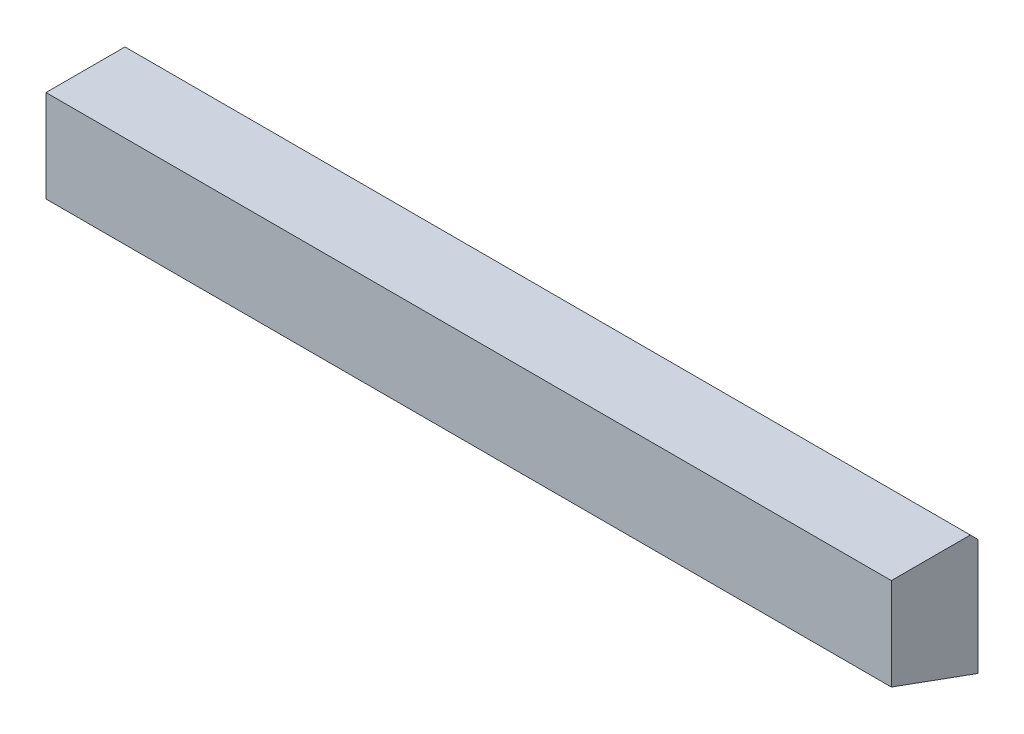
ISO-10303-21;
HEADER;
FILE_DESCRIPTION(('STEP AP214'),'2;1');
FILE_NAME('part.step','',(''),(''),'','','');
FILE_SCHEMA(('AUTOMOTIVE_DESIGN { 1 0 10303 214 1 1 1 1 }'));
ENDSEC;
DATA;
#1=APPLICATION_CONTEXT('core data for automotive mechanical design processes');
#2=APPLICATION_PROTOCOL_DEFINITION('international standard','automotive_design',2000,#1);
#3=PRODUCT_CONTEXT('',#1,'mechanical');
#4=PRODUCT('Part','Part','',(#3));
#5=PRODUCT_RELATED_PRODUCT_CATEGORY('part','',(#4));
#6=PRODUCT_DEFINITION_FORMATION('','',#4);
#7=PRODUCT_DEFINITION_CONTEXT('part definition',#1,'design');
#8=PRODUCT_DEFINITION('design','',#6,#7);
#9=PRODUCT_DEFINITION_SHAPE('','',#8);
#10=(LENGTH_UNIT() NAMED_UNIT(*) SI_UNIT(.MILLI.,.METRE.));
#11=(NAMED_UNIT(*) PLANE_ANGLE_UNIT() SI_UNIT($,.RADIAN.));
#12=(NAMED_UNIT(*) SI_UNIT($,.STERADIAN.) SOLID_ANGLE_UNIT());
#13=UNCERTAINTY_MEASURE_WITH_UNIT(LENGTH_MEASURE(1.E-05),#10,'distance_accuracy_value','');
#14=(GEOMETRIC_REPRESENTATION_CONTEXT(3) GLOBAL_UNCERTAINTY_ASSIGNED_CONTEXT((#13)) GLOBAL_UNIT_ASSIGNED_CONTEXT((#10,
#11,#12)) REPRESENTATION_CONTEXT('',''));
#15=CARTESIAN_POINT('',(0.,0.,0.));
#16=DIRECTION('',(0.,0.,1.));
#17=DIRECTION('',(1.,0.,0.));
#18=AXIS2_PLACEMENT_3D('',#15,#16,#17);
#19=CARTESIAN_POINT('',(55.,0.,0.));
#20=DIRECTION('',(0.,0.93969262078591,-0.342020143325665));
#21=DIRECTION('',(0.,0.342020143325665,0.93969262078591));
#22=AXIS2_PLACEMENT_3D('',#19,#20,#21);
#23=PLANE('',#22);
#24=DIRECTION('',(0.,-0.342020143325665,-0.93969262078591));
#25=VECTOR('',#24,1.);
#26=CARTESIAN_POINT('',(0.,0.,0.));
#27=LINE('',#26,#25);
#28=CARTESIAN_POINT('',(0.,0.,0.));
#29=VERTEX_POINT('',#28);
#30=CARTESIAN_POINT('',(0.,-2.05212085995399,-5.63815572471546));
#31=VERTEX_POINT('',#30);
#32=EDGE_CURVE('E106',#29,#31,#27,.T.);
#33=ORIENTED_EDGE('',*,*,#32,.T.);
#34=DIRECTION('',(-1.,0.,0.));
#35=VECTOR('',#34,1.);
#36=CARTESIAN_POINT('',(55.,-2.05212085995399,-5.63815572471546));
#37=LINE('',#36,#35);
#38=CARTESIAN_POINT('',(55.,-2.05212085995399,-5.63815572471546));
#39=VERTEX_POINT('',#38);
#40=EDGE_CURVE('E87',#39,#31,#37,.T.);
#41=ORIENTED_EDGE('',*,*,#40,.F.);
#42=DIRECTION('',(0.,-0.342020143325665,-0.93969262078591));
#43=VECTOR('',#42,1.);
#44=CARTESIAN_POINT('',(55.,0.,0.));
#45=LINE('',#44,#43);
#46=CARTESIAN_POINT('',(55.,0.,0.));
#47=VERTEX_POINT('',#46);
#48=EDGE_CURVE('E93',#47,#39,#45,.T.);
#49=ORIENTED_EDGE('',*,*,#48,.F.);
#50=DIRECTION('',(-1.,0.,0.));
#51=VECTOR('',#50,1.);
#52=CARTESIAN_POINT('',(55.,0.,0.));
#53=LINE('',#52,#51);
#54=EDGE_CURVE('E116',#47,#29,#53,.T.);
#55=ORIENTED_EDGE('',*,*,#54,.T.);
#56=EDGE_LOOP('',(#33,#41,#49,#55));
#57=FACE_BOUND('',#56,.T.);
#58=ADVANCED_FACE('F39',(#57),#23,.F.);
#59=CARTESIAN_POINT('',(55.,-2.05212085995399,-5.63815572471546));
#60=DIRECTION('',(0.,0.,1.));
#61=DIRECTION('',(0.,-1.,0.));
#62=AXIS2_PLACEMENT_3D('',#59,#60,#61);
#63=PLANE('',#62);
#64=DIRECTION('',(0.,1.,0.));
#65=VECTOR('',#64,1.);
#66=CARTESIAN_POINT('',(0.,-2.05212085995399,-5.63815572471546));
#67=LINE('',#66,#65);
#68=CARTESIAN_POINT('',(0.,5.5,-5.63815572471546));
#69=VERTEX_POINT('',#68);
#70=EDGE_CURVE('E129',#31,#69,#67,.T.);
#71=ORIENTED_EDGE('',*,*,#70,.T.);
#72=DIRECTION('',(1.,0.,0.));
#73=VECTOR('',#72,1.);
#74=CARTESIAN_POINT('',(55.,5.5,-5.63815572471546));
#75=LINE('',#74,#73);
#76=CARTESIAN_POINT('',(55.,5.5,-5.63815572471546));
#77=VERTEX_POINT('',#76);
#78=EDGE_CURVE('E48',#69,#77,#75,.T.);
#79=ORIENTED_EDGE('',*,*,#78,.T.);
#80=DIRECTION('',(0.,1.,0.));
#81=VECTOR('',#80,1.);
#82=CARTESIAN_POINT('',(55.,-2.05212085995399,-5.63815572471546));
#83=LINE('',#82,#81);
#84=EDGE_CURVE('E83',#39,#77,#83,.T.);
#85=ORIENTED_EDGE('',*,*,#84,.F.);
#86=ORIENTED_EDGE('',*,*,#40,.T.);
#87=EDGE_LOOP('',(#71,#79,#85,#86));
#88=FACE_BOUND('',#87,.T.);
#89=ADVANCED_FACE('F85',(#88),#63,.F.);
#90=CARTESIAN_POINT('',(55.,6.,-5.63815572471546));
#91=DIRECTION('',(0.,-1.,0.));
#92=DIRECTION('',(0.,0.,-1.));
#93=AXIS2_PLACEMENT_3D('',#90,#91,#92);
#94=PLANE('',#93);
#95=DIRECTION('',(0.,0.,1.));
#96=VECTOR('',#95,1.);
#97=CARTESIAN_POINT('',(55.,6.,-5.63815572471546));
#98=LINE('',#97,#96);
#99=CARTESIAN_POINT('',(55.,6.,-5.13815572471546));
#100=VERTEX_POINT('',#99);
#101=CARTESIAN_POINT('',(55.,6.,0.));
#102=VERTEX_POINT('',#101);
#103=EDGE_CURVE('E92',#100,#102,#98,.T.);
#104=ORIENTED_EDGE('',*,*,#103,.F.);
#105=DIRECTION('',(-1.,0.,0.));
#106=VECTOR('',#105,1.);
#107=CARTESIAN_POINT('',(55.,6.,-5.13815572471546));
#108=LINE('',#107,#106);
#109=CARTESIAN_POINT('',(0.,6.,-5.13815572471546));
#110=VERTEX_POINT('',#109);
#111=EDGE_CURVE('E108',#100,#110,#108,.T.);
#112=ORIENTED_EDGE('',*,*,#111,.T.);
#113=DIRECTION('',(0.,0.,1.));
#114=VECTOR('',#113,1.);
#115=CARTESIAN_POINT('',(0.,6.,-5.63815572471546));
#116=LINE('',#115,#114);
#117=CARTESIAN_POINT('',(0.,6.,0.));
#118=VERTEX_POINT('',#117);
#119=EDGE_CURVE('E126',#110,#118,#116,.T.);
#120=ORIENTED_EDGE('',*,*,#119,.T.);
#121=DIRECTION('',(-1.,0.,0.));
#122=VECTOR('',#121,1.);
#123=CARTESIAN_POINT('',(55.,6.,0.));
#124=LINE('',#123,#122);
#125=EDGE_CURVE('E109',#102,#118,#124,.T.);
#126=ORIENTED_EDGE('',*,*,#125,.F.);
#127=EDGE_LOOP('',(#104,#112,#120,#126));
#128=FACE_BOUND('',#127,.T.);
#129=ADVANCED_FACE('F141',(#128),#94,.F.);
#130=CARTESIAN_POINT('',(55.,6.,0.));
#131=DIRECTION('',(0.,0.,-1.));
#132=DIRECTION('',(-1.,0.,0.));
#133=AXIS2_PLACEMENT_3D('',#130,#131,#132);
#134=PLANE('',#133);
#135=DIRECTION('',(0.,-1.,0.));
#136=VECTOR('',#135,1.);
#137=CARTESIAN_POINT('',(0.,6.,0.));
#138=LINE('',#137,#136);
#139=EDGE_CURVE('E103',#118,#29,#138,.T.);
#140=ORIENTED_EDGE('',*,*,#139,.T.);
#141=ORIENTED_EDGE('',*,*,#54,.F.);
#142=DIRECTION('',(0.,-1.,0.));
#143=VECTOR('',#142,1.);
#144=CARTESIAN_POINT('',(55.,6.,0.));
#145=LINE('',#144,#143);
#146=EDGE_CURVE('E98',#102,#47,#145,.T.);
#147=ORIENTED_EDGE('',*,*,#146,.F.);
#148=ORIENTED_EDGE('',*,*,#125,.T.);
#149=EDGE_LOOP('',(#140,#141,#147,#148));
#150=FACE_BOUND('',#149,.T.);
#151=ADVANCED_FACE('F144',(#150),#134,.F.);
#152=CARTESIAN_POINT('',(55.,0.,0.));
#153=DIRECTION('',(1.,0.,0.));
#154=DIRECTION('',(0.,0.,-1.));
#155=AXIS2_PLACEMENT_3D('',#152,#153,#154);
#156=PLANE('',#155);
#157=ORIENTED_EDGE('',*,*,#84,.T.);
#158=DIRECTION('',(0.,-0.707106781186548,-0.707106781186548));
#159=VECTOR('',#158,1.);
#160=CARTESIAN_POINT('',(55.,5.56907786235773,-5.56907786235773));
#161=LINE('',#160,#159);
#162=EDGE_CURVE('E11',#77,#100,#161,.F.);
#163=ORIENTED_EDGE('',*,*,#162,.T.);
#164=ORIENTED_EDGE('',*,*,#103,.T.);
#165=ORIENTED_EDGE('',*,*,#146,.T.);
#166=ORIENTED_EDGE('',*,*,#48,.T.);
#167=EDGE_LOOP('',(#157,#163,#164,#165,#166));
#168=FACE_BOUND('',#167,.T.);
#169=ADVANCED_FACE('F96',(#168),#156,.T.);
#170=CARTESIAN_POINT('',(0.,0.,0.));
#171=DIRECTION('',(1.,0.,0.));
#172=DIRECTION('',(0.,0.,-1.));
#173=AXIS2_PLACEMENT_3D('',#170,#171,#172);
#174=PLANE('',#173);
#175=ORIENTED_EDGE('',*,*,#119,.F.);
#176=DIRECTION('',(0.,0.707106781186548,0.707106781186548));
#177=VECTOR('',#176,1.);
#178=CARTESIAN_POINT('',(0.,6.,-5.13815572471546));
#179=LINE('',#178,#177);
#180=EDGE_CURVE('E62',#110,#69,#179,.F.);
#181=ORIENTED_EDGE('',*,*,#180,.T.);
#182=ORIENTED_EDGE('',*,*,#70,.F.);
#183=ORIENTED_EDGE('',*,*,#32,.F.);
#184=ORIENTED_EDGE('',*,*,#139,.F.);
#185=EDGE_LOOP('',(#175,#181,#182,#183,#184));
#186=FACE_BOUND('',#185,.T.);
#187=ADVANCED_FACE('F145',(#186),#174,.F.);
#188=CARTESIAN_POINT('',(55.,6.,-5.13815572471546));
#189=DIRECTION('',(0.,-0.707106781186547,0.707106781186547));
#190=DIRECTION('',(-1.,0.,0.));
#191=AXIS2_PLACEMENT_3D('',#188,#189,#190);
#192=PLANE('',#191);
#193=ORIENTED_EDGE('',*,*,#162,.F.);
#194=ORIENTED_EDGE('',*,*,#78,.F.);
#195=ORIENTED_EDGE('',*,*,#180,.F.);
#196=ORIENTED_EDGE('',*,*,#111,.F.);
#197=EDGE_LOOP('',(#193,#194,#195,#196));
#198=FACE_BOUND('',#197,.T.);
#199=ADVANCED_FACE('F41',(#198),#192,.F.);
#200=CLOSED_SHELL('',(#58,#89,#129,#151,#169,#187,#199));
#201=MANIFOLD_SOLID_BREP('B2',#200);
#202=ADVANCED_BREP_SHAPE_REPRESENTATION('',(#18,#201),#14);
#203=SHAPE_DEFINITION_REPRESENTATION(#9,#202);
ENDSEC;
END-ISO-10303-21;
